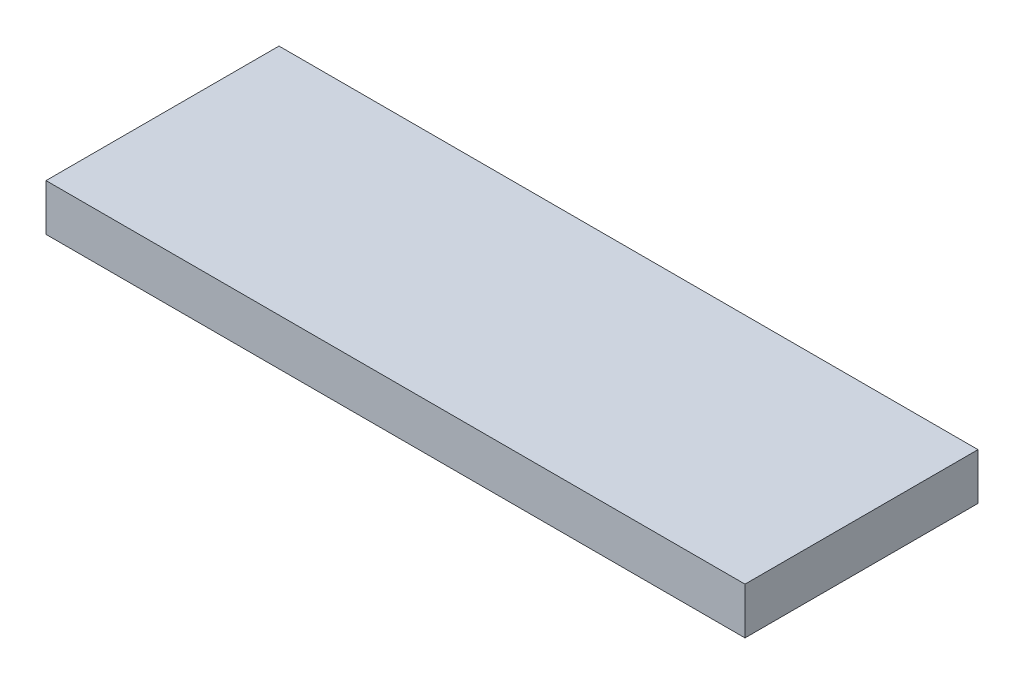
ISO-10303-21;
HEADER;
FILE_DESCRIPTION(('STEP AP214'),'2;1');
FILE_NAME('part.step','',(''),(''),'','','');
FILE_SCHEMA(('AUTOMOTIVE_DESIGN { 1 0 10303 214 1 1 1 1 }'));
ENDSEC;
DATA;
#1=APPLICATION_CONTEXT('core data for automotive mechanical design processes');
#2=APPLICATION_PROTOCOL_DEFINITION('international standard','automotive_design',2000,#1);
#3=PRODUCT_CONTEXT('',#1,'mechanical');
#4=PRODUCT('Part','Part','',(#3));
#5=PRODUCT_RELATED_PRODUCT_CATEGORY('part','',(#4));
#6=PRODUCT_DEFINITION_FORMATION('','',#4);
#7=PRODUCT_DEFINITION_CONTEXT('part definition',#1,'design');
#8=PRODUCT_DEFINITION('design','',#6,#7);
#9=PRODUCT_DEFINITION_SHAPE('','',#8);
#10=(LENGTH_UNIT() NAMED_UNIT(*) SI_UNIT(.MILLI.,.METRE.));
#11=(NAMED_UNIT(*) PLANE_ANGLE_UNIT() SI_UNIT($,.RADIAN.));
#12=(NAMED_UNIT(*) SI_UNIT($,.STERADIAN.) SOLID_ANGLE_UNIT());
#13=UNCERTAINTY_MEASURE_WITH_UNIT(LENGTH_MEASURE(1.E-05),#10,'distance_accuracy_value','');
#14=(GEOMETRIC_REPRESENTATION_CONTEXT(3) GLOBAL_UNCERTAINTY_ASSIGNED_CONTEXT((#13)) GLOBAL_UNIT_ASSIGNED_CONTEXT((#10,
#11,#12)) REPRESENTATION_CONTEXT('',''));
#15=CARTESIAN_POINT('',(0.,0.,0.));
#16=DIRECTION('',(0.,0.,1.));
#17=DIRECTION('',(1.,0.,0.));
#18=AXIS2_PLACEMENT_3D('',#15,#16,#17);
#19=CARTESIAN_POINT('',(0.,2.54,0.));
#20=DIRECTION('',(0.,0.,-1.));
#21=DIRECTION('',(-1.,0.,0.));
#22=AXIS2_PLACEMENT_3D('',#19,#20,#21);
#23=PLANE('',#22);
#24=DIRECTION('',(1.,0.,0.));
#25=VECTOR('',#24,1.);
#26=CARTESIAN_POINT('',(0.,0.,0.));
#27=LINE('',#26,#25);
#28=CARTESIAN_POINT('',(0.,0.,0.));
#29=VERTEX_POINT('',#28);
#30=CARTESIAN_POINT('',(38.1,0.,0.));
#31=VERTEX_POINT('',#30);
#32=EDGE_CURVE('E96',#29,#31,#27,.T.);
#33=ORIENTED_EDGE('',*,*,#32,.T.);
#34=DIRECTION('',(0.,-1.,0.));
#35=VECTOR('',#34,1.);
#36=CARTESIAN_POINT('',(38.1,2.54,0.));
#37=LINE('',#36,#35);
#38=CARTESIAN_POINT('',(38.1,2.54,0.));
#39=VERTEX_POINT('',#38);
#40=EDGE_CURVE('E11',#39,#31,#37,.T.);
#41=ORIENTED_EDGE('',*,*,#40,.F.);
#42=DIRECTION('',(1.,0.,0.));
#43=VECTOR('',#42,1.);
#44=CARTESIAN_POINT('',(0.,2.54,0.));
#45=LINE('',#44,#43);
#46=CARTESIAN_POINT('',(0.,2.54,0.));
#47=VERTEX_POINT('',#46);
#48=EDGE_CURVE('E82',#47,#39,#45,.T.);
#49=ORIENTED_EDGE('',*,*,#48,.F.);
#50=DIRECTION('',(0.,-1.,0.));
#51=VECTOR('',#50,1.);
#52=CARTESIAN_POINT('',(0.,2.54,0.));
#53=LINE('',#52,#51);
#54=EDGE_CURVE('E49',#47,#29,#53,.T.);
#55=ORIENTED_EDGE('',*,*,#54,.T.);
#56=EDGE_LOOP('',(#33,#41,#49,#55));
#57=FACE_BOUND('',#56,.T.);
#58=ADVANCED_FACE('F33',(#57),#23,.F.);
#59=CARTESIAN_POINT('',(38.1,2.54,0.));
#60=DIRECTION('',(-1.,0.,0.));
#61=DIRECTION('',(0.,0.,1.));
#62=AXIS2_PLACEMENT_3D('',#59,#60,#61);
#63=PLANE('',#62);
#64=DIRECTION('',(0.,0.,-1.));
#65=VECTOR('',#64,1.);
#66=CARTESIAN_POINT('',(38.1,0.,0.));
#67=LINE('',#66,#65);
#68=CARTESIAN_POINT('',(38.1,0.,-12.7));
#69=VERTEX_POINT('',#68);
#70=EDGE_CURVE('E87',#31,#69,#67,.T.);
#71=ORIENTED_EDGE('',*,*,#70,.T.);
#72=DIRECTION('',(0.,-1.,0.));
#73=VECTOR('',#72,1.);
#74=CARTESIAN_POINT('',(38.1,2.54,-12.7));
#75=LINE('',#74,#73);
#76=CARTESIAN_POINT('',(38.1,2.54,-12.7));
#77=VERTEX_POINT('',#76);
#78=EDGE_CURVE('E41',#77,#69,#75,.T.);
#79=ORIENTED_EDGE('',*,*,#78,.F.);
#80=DIRECTION('',(0.,0.,-1.));
#81=VECTOR('',#80,1.);
#82=CARTESIAN_POINT('',(38.1,2.54,0.));
#83=LINE('',#82,#81);
#84=EDGE_CURVE('E74',#39,#77,#83,.T.);
#85=ORIENTED_EDGE('',*,*,#84,.F.);
#86=ORIENTED_EDGE('',*,*,#40,.T.);
#87=EDGE_LOOP('',(#71,#79,#85,#86));
#88=FACE_BOUND('',#87,.T.);
#89=ADVANCED_FACE('F86',(#88),#63,.F.);
#90=CARTESIAN_POINT('',(0.,2.54,-12.7));
#91=DIRECTION('',(0.,0.,-1.));
#92=DIRECTION('',(-1.,0.,0.));
#93=AXIS2_PLACEMENT_3D('',#90,#91,#92);
#94=PLANE('',#93);
#95=DIRECTION('',(1.,0.,0.));
#96=VECTOR('',#95,1.);
#97=CARTESIAN_POINT('',(0.,0.,-12.7));
#98=LINE('',#97,#96);
#99=CARTESIAN_POINT('',(0.,0.,-12.7));
#100=VERTEX_POINT('',#99);
#101=EDGE_CURVE('E99',#100,#69,#98,.T.);
#102=ORIENTED_EDGE('',*,*,#101,.F.);
#103=DIRECTION('',(0.,-1.,0.));
#104=VECTOR('',#103,1.);
#105=CARTESIAN_POINT('',(0.,2.54,-12.7));
#106=LINE('',#105,#104);
#107=CARTESIAN_POINT('',(0.,2.54,-12.7));
#108=VERTEX_POINT('',#107);
#109=EDGE_CURVE('E63',#108,#100,#106,.T.);
#110=ORIENTED_EDGE('',*,*,#109,.F.);
#111=DIRECTION('',(1.,0.,0.));
#112=VECTOR('',#111,1.);
#113=CARTESIAN_POINT('',(0.,2.54,-12.7));
#114=LINE('',#113,#112);
#115=EDGE_CURVE('E81',#108,#77,#114,.T.);
#116=ORIENTED_EDGE('',*,*,#115,.T.);
#117=ORIENTED_EDGE('',*,*,#78,.T.);
#118=EDGE_LOOP('',(#102,#110,#116,#117));
#119=FACE_BOUND('',#118,.T.);
#120=ADVANCED_FACE('F90',(#119),#94,.T.);
#121=CARTESIAN_POINT('',(0.,2.54,0.));
#122=DIRECTION('',(-1.,0.,0.));
#123=DIRECTION('',(0.,0.,1.));
#124=AXIS2_PLACEMENT_3D('',#121,#122,#123);
#125=PLANE('',#124);
#126=DIRECTION('',(0.,0.,-1.));
#127=VECTOR('',#126,1.);
#128=CARTESIAN_POINT('',(0.,0.,0.));
#129=LINE('',#128,#127);
#130=EDGE_CURVE('E101',#29,#100,#129,.T.);
#131=ORIENTED_EDGE('',*,*,#130,.F.);
#132=ORIENTED_EDGE('',*,*,#54,.F.);
#133=DIRECTION('',(0.,0.,-1.));
#134=VECTOR('',#133,1.);
#135=CARTESIAN_POINT('',(0.,2.54,0.));
#136=LINE('',#135,#134);
#137=EDGE_CURVE('E91',#47,#108,#136,.T.);
#138=ORIENTED_EDGE('',*,*,#137,.T.);
#139=ORIENTED_EDGE('',*,*,#109,.T.);
#140=EDGE_LOOP('',(#131,#132,#138,#139));
#141=FACE_BOUND('',#140,.T.);
#142=ADVANCED_FACE('F107',(#141),#125,.T.);
#143=CARTESIAN_POINT('',(0.,2.54,0.));
#144=DIRECTION('',(0.,1.,0.));
#145=DIRECTION('',(0.,0.,1.));
#146=AXIS2_PLACEMENT_3D('',#143,#144,#145);
#147=PLANE('',#146);
#148=ORIENTED_EDGE('',*,*,#48,.T.);
#149=ORIENTED_EDGE('',*,*,#84,.T.);
#150=ORIENTED_EDGE('',*,*,#115,.F.);
#151=ORIENTED_EDGE('',*,*,#137,.F.);
#152=EDGE_LOOP('',(#148,#149,#150,#151));
#153=FACE_BOUND('',#152,.T.);
#154=ADVANCED_FACE('F78',(#153),#147,.T.);
#155=CARTESIAN_POINT('',(0.,0.,0.));
#156=DIRECTION('',(0.,1.,0.));
#157=DIRECTION('',(0.,0.,1.));
#158=AXIS2_PLACEMENT_3D('',#155,#156,#157);
#159=PLANE('',#158);
#160=ORIENTED_EDGE('',*,*,#32,.F.);
#161=ORIENTED_EDGE('',*,*,#130,.T.);
#162=ORIENTED_EDGE('',*,*,#101,.T.);
#163=ORIENTED_EDGE('',*,*,#70,.F.);
#164=EDGE_LOOP('',(#160,#161,#162,#163));
#165=FACE_BOUND('',#164,.T.);
#166=ADVANCED_FACE('F106',(#165),#159,.F.);
#167=CLOSED_SHELL('',(#58,#89,#120,#142,#154,#166));
#168=MANIFOLD_SOLID_BREP('B2',#167);
#169=ADVANCED_BREP_SHAPE_REPRESENTATION('',(#18,#168),#14);
#170=SHAPE_DEFINITION_REPRESENTATION(#9,#169);
ENDSEC;
END-ISO-10303-21;
